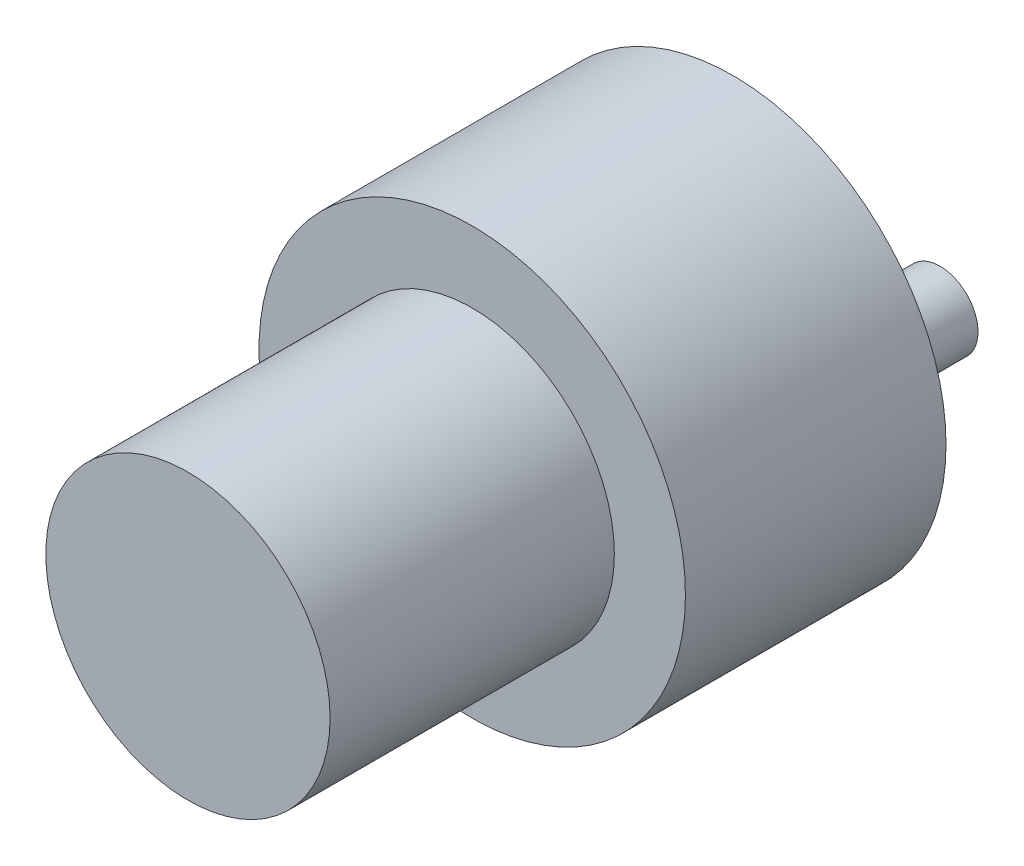
ISO-10303-21;
HEADER;
FILE_DESCRIPTION(('STEP AP214'),'2;1');
FILE_NAME('part.step','',(''),(''),'','','');
FILE_SCHEMA(('AUTOMOTIVE_DESIGN { 1 0 10303 214 1 1 1 1 }'));
ENDSEC;
DATA;
#1=APPLICATION_CONTEXT('core data for automotive mechanical design processes');
#2=APPLICATION_PROTOCOL_DEFINITION('international standard','automotive_design',2000,#1);
#3=PRODUCT_CONTEXT('',#1,'mechanical');
#4=PRODUCT('Part','Part','',(#3));
#5=PRODUCT_RELATED_PRODUCT_CATEGORY('part','',(#4));
#6=PRODUCT_DEFINITION_FORMATION('','',#4);
#7=PRODUCT_DEFINITION_CONTEXT('part definition',#1,'design');
#8=PRODUCT_DEFINITION('design','',#6,#7);
#9=PRODUCT_DEFINITION_SHAPE('','',#8);
#10=(LENGTH_UNIT() NAMED_UNIT(*) SI_UNIT(.MILLI.,.METRE.));
#11=(NAMED_UNIT(*) PLANE_ANGLE_UNIT() SI_UNIT($,.RADIAN.));
#12=(NAMED_UNIT(*) SI_UNIT($,.STERADIAN.) SOLID_ANGLE_UNIT());
#13=UNCERTAINTY_MEASURE_WITH_UNIT(LENGTH_MEASURE(1.E-05),#10,'distance_accuracy_value','');
#14=(GEOMETRIC_REPRESENTATION_CONTEXT(3) GLOBAL_UNCERTAINTY_ASSIGNED_CONTEXT((#13)) GLOBAL_UNIT_ASSIGNED_CONTEXT((#10,
#11,#12)) REPRESENTATION_CONTEXT('',''));
#15=CARTESIAN_POINT('',(0.,0.,0.));
#16=DIRECTION('',(0.,0.,1.));
#17=DIRECTION('',(1.,0.,0.));
#18=AXIS2_PLACEMENT_3D('',#15,#16,#17);
#19=CARTESIAN_POINT('',(0.,0.,57.5));
#20=DIRECTION('',(0.,0.,-1.));
#21=DIRECTION('',(-1.,0.,0.));
#22=AXIS2_PLACEMENT_3D('',#19,#20,#21);
#23=CYLINDRICAL_SURFACE('',#22,15.);
#24=CARTESIAN_POINT('',(0.,0.,57.5));
#25=DIRECTION('',(0.,0.,1.));
#26=DIRECTION('',(1.,0.,0.));
#27=AXIS2_PLACEMENT_3D('',#24,#25,#26);
#28=CIRCLE('',#27,15.);
#29=CARTESIAN_POINT('',(15.,0.,57.5));
#30=VERTEX_POINT('',#29);
#31=EDGE_CURVE('E11',#30,#30,#28,.T.);
#32=ORIENTED_EDGE('',*,*,#31,.F.);
#33=EDGE_LOOP('',(#32));
#34=FACE_BOUND('',#33,.T.);
#35=CARTESIAN_POINT('',(0.,0.,27.5));
#36=DIRECTION('',(0.,0.,1.));
#37=DIRECTION('',(1.,0.,0.));
#38=AXIS2_PLACEMENT_3D('',#35,#36,#37);
#39=CIRCLE('',#38,15.);
#40=CARTESIAN_POINT('',(15.,0.,27.5));
#41=VERTEX_POINT('',#40);
#42=EDGE_CURVE('E42',#41,#41,#39,.T.);
#43=ORIENTED_EDGE('',*,*,#42,.T.);
#44=EDGE_LOOP('',(#43));
#45=FACE_BOUND('',#44,.T.);
#46=ADVANCED_FACE('F39',(#34,#45),#23,.T.);
#47=CARTESIAN_POINT('',(0.,0.,57.5));
#48=DIRECTION('',(0.,0.,1.));
#49=DIRECTION('',(1.,0.,0.));
#50=AXIS2_PLACEMENT_3D('',#47,#48,#49);
#51=PLANE('',#50);
#52=ORIENTED_EDGE('',*,*,#31,.T.);
#53=EDGE_LOOP('',(#52));
#54=FACE_BOUND('',#53,.T.);
#55=ADVANCED_FACE('F54',(#54),#51,.T.);
#56=CARTESIAN_POINT('',(0.,0.,27.5));
#57=DIRECTION('',(0.,0.,1.));
#58=DIRECTION('',(1.,0.,0.));
#59=AXIS2_PLACEMENT_3D('',#56,#57,#58);
#60=PLANE('',#59);
#61=ORIENTED_EDGE('',*,*,#42,.F.);
#62=EDGE_LOOP('',(#61));
#63=FACE_BOUND('',#62,.T.);
#64=ADVANCED_FACE('F52',(#63),#60,.F.);
#65=CLOSED_SHELL('',(#46,#55,#64));
#66=MANIFOLD_SOLID_BREP('B2',#65);
#67=CARTESIAN_POINT('',(0.,0.,27.5));
#68=DIRECTION('',(0.,0.,-1.));
#69=DIRECTION('',(-1.,0.,0.));
#70=AXIS2_PLACEMENT_3D('',#67,#68,#69);
#71=CYLINDRICAL_SURFACE('',#70,22.5);
#72=CARTESIAN_POINT('',(0.,0.,27.5));
#73=DIRECTION('',(0.,0.,1.));
#74=DIRECTION('',(1.,0.,0.));
#75=AXIS2_PLACEMENT_3D('',#72,#73,#74);
#76=CIRCLE('',#75,22.5);
#77=CARTESIAN_POINT('',(22.5,0.,27.5));
#78=VERTEX_POINT('',#77);
#79=EDGE_CURVE('E86',#78,#78,#76,.T.);
#80=ORIENTED_EDGE('',*,*,#79,.F.);
#81=EDGE_LOOP('',(#80));
#82=FACE_BOUND('',#81,.T.);
#83=CARTESIAN_POINT('',(0.,0.,0.));
#84=DIRECTION('',(0.,0.,1.));
#85=DIRECTION('',(1.,0.,0.));
#86=AXIS2_PLACEMENT_3D('',#83,#84,#85);
#87=CIRCLE('',#86,22.5);
#88=CARTESIAN_POINT('',(22.5,0.,0.));
#89=VERTEX_POINT('',#88);
#90=EDGE_CURVE('E90',#89,#89,#87,.T.);
#91=ORIENTED_EDGE('',*,*,#90,.T.);
#92=EDGE_LOOP('',(#91));
#93=FACE_BOUND('',#92,.T.);
#94=ADVANCED_FACE('F80',(#82,#93),#71,.T.);
#95=CARTESIAN_POINT('',(0.,0.,27.5));
#96=DIRECTION('',(0.,0.,1.));
#97=DIRECTION('',(1.,0.,0.));
#98=AXIS2_PLACEMENT_3D('',#95,#96,#97);
#99=PLANE('',#98);
#100=ORIENTED_EDGE('',*,*,#79,.T.);
#101=EDGE_LOOP('',(#100));
#102=FACE_BOUND('',#101,.T.);
#103=ADVANCED_FACE('F111',(#102),#99,.T.);
#104=CARTESIAN_POINT('',(0.,0.,0.));
#105=DIRECTION('',(0.,0.,1.));
#106=DIRECTION('',(1.,0.,0.));
#107=AXIS2_PLACEMENT_3D('',#104,#105,#106);
#108=PLANE('',#107);
#109=CARTESIAN_POINT('',(9.87583974276163,0.,0.));
#110=DIRECTION('',(0.,0.,1.));
#111=DIRECTION('',(1.,0.,0.));
#112=AXIS2_PLACEMENT_3D('',#109,#110,#111);
#113=CIRCLE('',#112,4.);
#114=CARTESIAN_POINT('',(13.8758397427616,0.,0.));
#115=VERTEX_POINT('',#114);
#116=EDGE_CURVE('E38',#115,#115,#113,.F.);
#117=ORIENTED_EDGE('',*,*,#116,.F.);
#118=EDGE_LOOP('',(#117));
#119=FACE_BOUND('',#118,.T.);
#120=ORIENTED_EDGE('',*,*,#90,.F.);
#121=EDGE_LOOP('',(#120));
#122=FACE_BOUND('',#121,.T.);
#123=ADVANCED_FACE('F104',(#119,#122),#108,.F.);
#124=CARTESIAN_POINT('',(9.87583974276163,0.,-12.));
#125=DIRECTION('',(0.,0.,1.));
#126=DIRECTION('',(1.,0.,0.));
#127=AXIS2_PLACEMENT_3D('',#124,#125,#126);
#128=CYLINDRICAL_SURFACE('',#127,4.);
#129=CARTESIAN_POINT('',(9.87583974276163,0.,-12.));
#130=DIRECTION('',(0.,0.,-1.));
#131=DIRECTION('',(-1.,0.,0.));
#132=AXIS2_PLACEMENT_3D('',#129,#130,#131);
#133=CIRCLE('',#132,4.);
#134=CARTESIAN_POINT('',(5.87583974276163,0.,-12.));
#135=VERTEX_POINT('',#134);
#136=EDGE_CURVE('E95',#135,#135,#133,.T.);
#137=ORIENTED_EDGE('',*,*,#136,.F.);
#138=EDGE_LOOP('',(#137));
#139=FACE_BOUND('',#138,.T.);
#140=ORIENTED_EDGE('',*,*,#116,.T.);
#141=EDGE_LOOP('',(#140));
#142=FACE_BOUND('',#141,.T.);
#143=ADVANCED_FACE('F102',(#139,#142),#128,.T.);
#144=CARTESIAN_POINT('',(9.87583974276163,0.,-12.));
#145=DIRECTION('',(0.,0.,-1.));
#146=DIRECTION('',(-1.,0.,0.));
#147=AXIS2_PLACEMENT_3D('',#144,#145,#146);
#148=PLANE('',#147);
#149=ORIENTED_EDGE('',*,*,#136,.T.);
#150=EDGE_LOOP('',(#149));
#151=FACE_BOUND('',#150,.T.);
#152=ADVANCED_FACE('F100',(#151),#148,.T.);
#153=CLOSED_SHELL('',(#94,#103,#123,#143,#152));
#154=MANIFOLD_SOLID_BREP('B6',#153);
#155=ADVANCED_BREP_SHAPE_REPRESENTATION('',(#18,#66,#154),#14);
#156=SHAPE_DEFINITION_REPRESENTATION(#9,#155);
ENDSEC;
END-ISO-10303-21;
